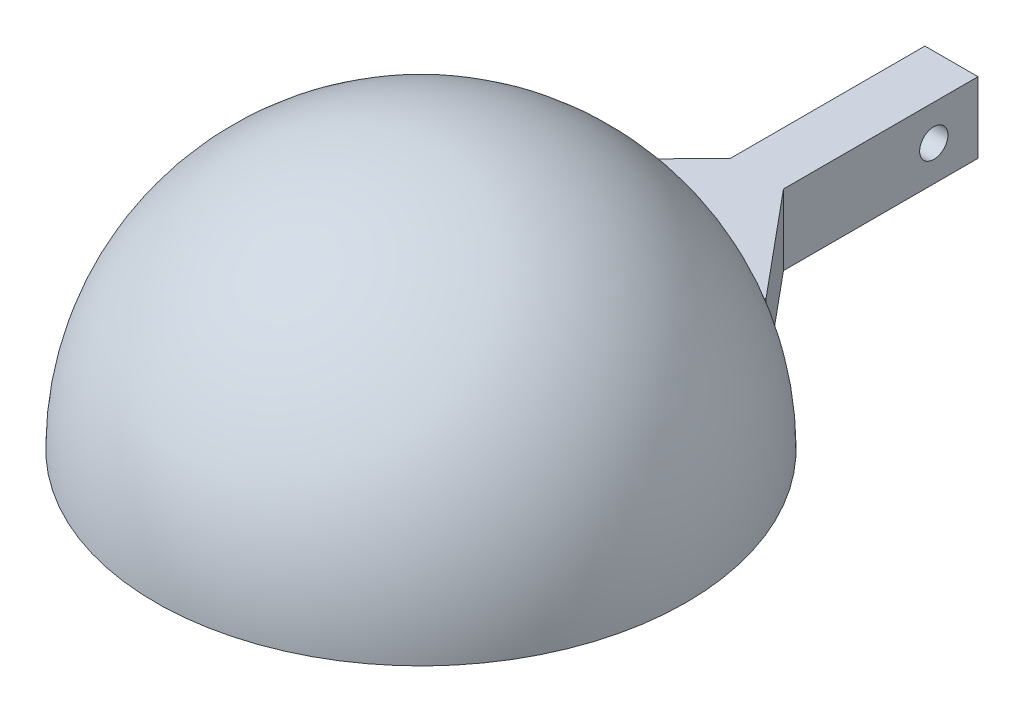
ISO-10303-21;
HEADER;
FILE_DESCRIPTION(('STEP AP214'),'2;1');
FILE_NAME('part.step','',(''),(''),'','','');
FILE_SCHEMA(('AUTOMOTIVE_DESIGN { 1 0 10303 214 1 1 1 1 }'));
ENDSEC;
DATA;
#1=APPLICATION_CONTEXT('core data for automotive mechanical design processes');
#2=APPLICATION_PROTOCOL_DEFINITION('international standard','automotive_design',2000,#1);
#3=PRODUCT_CONTEXT('',#1,'mechanical');
#4=PRODUCT('Part','Part','',(#3));
#5=PRODUCT_RELATED_PRODUCT_CATEGORY('part','',(#4));
#6=PRODUCT_DEFINITION_FORMATION('','',#4);
#7=PRODUCT_DEFINITION_CONTEXT('part definition',#1,'design');
#8=PRODUCT_DEFINITION('design','',#6,#7);
#9=PRODUCT_DEFINITION_SHAPE('','',#8);
#10=(LENGTH_UNIT() NAMED_UNIT(*) SI_UNIT(.MILLI.,.METRE.));
#11=(NAMED_UNIT(*) PLANE_ANGLE_UNIT() SI_UNIT($,.RADIAN.));
#12=(NAMED_UNIT(*) SI_UNIT($,.STERADIAN.) SOLID_ANGLE_UNIT());
#13=UNCERTAINTY_MEASURE_WITH_UNIT(LENGTH_MEASURE(1.E-05),#10,'distance_accuracy_value','');
#14=(GEOMETRIC_REPRESENTATION_CONTEXT(3) GLOBAL_UNCERTAINTY_ASSIGNED_CONTEXT((#13)) GLOBAL_UNIT_ASSIGNED_CONTEXT((#10,
#11,#12)) REPRESENTATION_CONTEXT('',''));
#15=CARTESIAN_POINT('',(0.,0.,0.));
#16=DIRECTION('',(0.,0.,1.));
#17=DIRECTION('',(1.,0.,0.));
#18=AXIS2_PLACEMENT_3D('',#15,#16,#17);
#19=CARTESIAN_POINT('',(-20.5301903420692,8.,-20.0496930716239));
#20=DIRECTION('',(0.715429322256353,0.,0.698685111374084));
#21=DIRECTION('',(0.698685111374084,0.,-0.715429322256353));
#22=AXIS2_PLACEMENT_3D('',#19,#20,#21);
#23=PLANE('',#22);
#24=DIRECTION('',(-0.698685111374084,0.,0.715429322256353));
#25=VECTOR('',#24,1.);
#26=CARTESIAN_POINT('',(-20.5301903420692,0.,-20.0496930716239));
#27=LINE('',#26,#25);
#28=CARTESIAN_POINT('',(-3.,0.,-38.));
#29=VERTEX_POINT('',#28);
#30=CARTESIAN_POINT('',(-14.4183490398174,0.,-26.308006594305));
#31=VERTEX_POINT('',#30);
#32=EDGE_CURVE('E141',#29,#31,#27,.T.);
#33=ORIENTED_EDGE('',*,*,#32,.T.);
#34=DIRECTION('',(0.,-1.,0.));
#35=VECTOR('',#34,1.);
#36=CARTESIAN_POINT('',(-14.4183490398174,8.,-26.308006594305));
#37=LINE('',#36,#35);
#38=CARTESIAN_POINT('',(-14.4183490398174,8.,-26.308006594305));
#39=VERTEX_POINT('',#38);
#40=EDGE_CURVE('E12',#39,#31,#37,.T.);
#41=ORIENTED_EDGE('',*,*,#40,.F.);
#42=DIRECTION('',(-0.698685111374084,0.,0.715429322256353));
#43=VECTOR('',#42,1.);
#44=CARTESIAN_POINT('',(-20.5301903420692,8.,-20.0496930716239));
#45=LINE('',#44,#43);
#46=CARTESIAN_POINT('',(-3.,8.,-38.));
#47=VERTEX_POINT('',#46);
#48=EDGE_CURVE('E158',#47,#39,#45,.T.);
#49=ORIENTED_EDGE('',*,*,#48,.F.);
#50=DIRECTION('',(0.,-1.,0.));
#51=VECTOR('',#50,1.);
#52=CARTESIAN_POINT('',(-3.,8.,-38.));
#53=LINE('',#52,#51);
#54=EDGE_CURVE('E140',#47,#29,#53,.T.);
#55=ORIENTED_EDGE('',*,*,#54,.T.);
#56=EDGE_LOOP('',(#33,#41,#49,#55));
#57=FACE_BOUND('',#56,.T.);
#58=ADVANCED_FACE('F43',(#57),#23,.F.);
#59=CARTESIAN_POINT('',(0.,8.,0.));
#60=DIRECTION('',(0.8769335531435,0.,-0.480611634660581));
#61=DIRECTION('',(-0.480611634660581,0.,-0.8769335531435));
#62=AXIS2_PLACEMENT_3D('',#59,#60,#61);
#63=PLANE('',#62);
#64=DIRECTION('',(0.480611634660581,0.,0.8769335531435));
#65=VECTOR('',#64,1.);
#66=CARTESIAN_POINT('',(0.,0.,0.));
#67=LINE('',#66,#65);
#68=CARTESIAN_POINT('',(-13.4571257704963,0.,-24.554139488018));
#69=VERTEX_POINT('',#68);
#70=EDGE_CURVE('E94',#31,#69,#67,.T.);
#71=ORIENTED_EDGE('',*,*,#70,.T.);
#72=DIRECTION('',(0.,-1.,0.));
#73=VECTOR('',#72,1.);
#74=CARTESIAN_POINT('',(-13.4571257704963,8.,-24.554139488018));
#75=LINE('',#74,#73);
#76=CARTESIAN_POINT('',(-13.4571257704963,8.,-24.554139488018));
#77=VERTEX_POINT('',#76);
#78=EDGE_CURVE('E52',#77,#69,#75,.T.);
#79=ORIENTED_EDGE('',*,*,#78,.F.);
#80=DIRECTION('',(0.480611634660581,0.,0.8769335531435));
#81=VECTOR('',#80,1.);
#82=CARTESIAN_POINT('',(0.,8.,0.));
#83=LINE('',#82,#81);
#84=EDGE_CURVE('E60',#39,#77,#83,.T.);
#85=ORIENTED_EDGE('',*,*,#84,.F.);
#86=ORIENTED_EDGE('',*,*,#40,.T.);
#87=EDGE_LOOP('',(#71,#79,#85,#86));
#88=FACE_BOUND('',#87,.T.);
#89=ADVANCED_FACE('F209',(#88),#63,.F.);
#90=CARTESIAN_POINT('',(0.,8.,0.));
#91=DIRECTION('',(0.,-1.,0.));
#92=DIRECTION('',(0.,0.,-1.));
#93=AXIS2_PLACEMENT_3D('',#90,#91,#92);
#94=CYLINDRICAL_SURFACE('',#93,28.);
#95=CARTESIAN_POINT('',(0.,0.,0.));
#96=DIRECTION('',(0.,-1.,0.));
#97=DIRECTION('',(0.,0.,-1.));
#98=AXIS2_PLACEMENT_3D('',#95,#96,#97);
#99=CIRCLE('',#98,28.);
#100=CARTESIAN_POINT('',(12.1903463480089,0.,-25.2070517100986));
#101=VERTEX_POINT('',#100);
#102=EDGE_CURVE('E119',#101,#69,#99,.F.);
#103=ORIENTED_EDGE('',*,*,#102,.F.);
#104=DIRECTION('',(0.,-1.,0.));
#105=VECTOR('',#104,1.);
#106=CARTESIAN_POINT('',(12.1903463480089,8.,-25.2070517100986));
#107=LINE('',#106,#105);
#108=CARTESIAN_POINT('',(12.1903463480089,8.,-25.2070517100986));
#109=VERTEX_POINT('',#108);
#110=EDGE_CURVE('E115',#109,#101,#107,.T.);
#111=ORIENTED_EDGE('',*,*,#110,.F.);
#112=CARTESIAN_POINT('',(0.,8.,0.));
#113=DIRECTION('',(0.,-1.,0.));
#114=DIRECTION('',(0.,0.,-1.));
#115=AXIS2_PLACEMENT_3D('',#112,#113,#114);
#116=CIRCLE('',#115,28.);
#117=EDGE_CURVE('E118',#109,#77,#116,.F.);
#118=ORIENTED_EDGE('',*,*,#117,.T.);
#119=ORIENTED_EDGE('',*,*,#78,.T.);
#120=EDGE_LOOP('',(#103,#111,#118,#119));
#121=FACE_BOUND('',#120,.T.);
#122=ADVANCED_FACE('F117',(#121),#94,.F.);
#123=CARTESIAN_POINT('',(0.,8.,0.));
#124=DIRECTION('',(0.900251846789237,0.,0.435369512428888));
#125=DIRECTION('',(0.435369512428888,0.,-0.900251846789237));
#126=AXIS2_PLACEMENT_3D('',#123,#124,#125);
#127=PLANE('',#126);
#128=DIRECTION('',(-0.435369512428888,0.,0.900251846789237));
#129=VECTOR('',#128,1.);
#130=CARTESIAN_POINT('',(0.,0.,0.));
#131=LINE('',#130,#129);
#132=CARTESIAN_POINT('',(12.7227775702859,0.,-26.308006594305));
#133=VERTEX_POINT('',#132);
#134=EDGE_CURVE('E155',#133,#101,#131,.T.);
#135=ORIENTED_EDGE('',*,*,#134,.F.);
#136=DIRECTION('',(0.,-1.,0.));
#137=VECTOR('',#136,1.);
#138=CARTESIAN_POINT('',(12.7227775702859,8.,-26.308006594305));
#139=LINE('',#138,#137);
#140=CARTESIAN_POINT('',(12.7227775702859,8.,-26.308006594305));
#141=VERTEX_POINT('',#140);
#142=EDGE_CURVE('E124',#141,#133,#139,.T.);
#143=ORIENTED_EDGE('',*,*,#142,.F.);
#144=DIRECTION('',(-0.435369512428888,0.,0.900251846789237));
#145=VECTOR('',#144,1.);
#146=CARTESIAN_POINT('',(0.,8.,0.));
#147=LINE('',#146,#145);
#148=EDGE_CURVE('E129',#141,#109,#147,.T.);
#149=ORIENTED_EDGE('',*,*,#148,.T.);
#150=ORIENTED_EDGE('',*,*,#110,.T.);
#151=EDGE_LOOP('',(#135,#143,#149,#150));
#152=FACE_BOUND('',#151,.T.);
#153=ADVANCED_FACE('F132',(#152),#127,.T.);
#154=CARTESIAN_POINT('',(20.4549248823464,8.,-17.0098184242124));
#155=DIRECTION('',(0.768885498760629,0.,-0.639386494849257));
#156=DIRECTION('',(-0.639386494849257,0.,-0.768885498760629));
#157=AXIS2_PLACEMENT_3D('',#154,#155,#156);
#158=PLANE('',#157);
#159=DIRECTION('',(0.639386494849257,0.,0.768885498760629));
#160=VECTOR('',#159,1.);
#161=CARTESIAN_POINT('',(20.4549248823464,0.,-17.0098184242124));
#162=LINE('',#161,#160);
#163=CARTESIAN_POINT('',(3.,0.,-38.));
#164=VERTEX_POINT('',#163);
#165=EDGE_CURVE('E152',#164,#133,#162,.T.);
#166=ORIENTED_EDGE('',*,*,#165,.F.);
#167=DIRECTION('',(0.,-1.,0.));
#168=VECTOR('',#167,1.);
#169=CARTESIAN_POINT('',(3.,8.,-38.));
#170=LINE('',#169,#168);
#171=CARTESIAN_POINT('',(3.,8.,-38.));
#172=VERTEX_POINT('',#171);
#173=EDGE_CURVE('E162',#172,#164,#170,.T.);
#174=ORIENTED_EDGE('',*,*,#173,.F.);
#175=DIRECTION('',(0.639386494849257,0.,0.768885498760629));
#176=VECTOR('',#175,1.);
#177=CARTESIAN_POINT('',(20.4549248823464,8.,-17.0098184242124));
#178=LINE('',#177,#176);
#179=EDGE_CURVE('E133',#172,#141,#178,.T.);
#180=ORIENTED_EDGE('',*,*,#179,.T.);
#181=ORIENTED_EDGE('',*,*,#142,.T.);
#182=EDGE_LOOP('',(#166,#174,#180,#181));
#183=FACE_BOUND('',#182,.T.);
#184=ADVANCED_FACE('F186',(#183),#158,.T.);
#185=CARTESIAN_POINT('',(3.,8.,0.));
#186=DIRECTION('',(1.,0.,0.));
#187=DIRECTION('',(0.,0.,-1.));
#188=AXIS2_PLACEMENT_3D('',#185,#186,#187);
#189=PLANE('',#188);
#190=CARTESIAN_POINT('',(3.,4.,-55.));
#191=DIRECTION('',(1.,0.,0.));
#192=DIRECTION('',(0.,0.,-1.));
#193=AXIS2_PLACEMENT_3D('',#190,#191,#192);
#194=CIRCLE('',#193,1.6);
#195=CARTESIAN_POINT('',(3.,4.,-56.6));
#196=VERTEX_POINT('',#195);
#197=EDGE_CURVE('E191',#196,#196,#194,.T.);
#198=ORIENTED_EDGE('',*,*,#197,.F.);
#199=EDGE_LOOP('',(#198));
#200=FACE_BOUND('',#199,.T.);
#201=DIRECTION('',(0.,0.,1.));
#202=VECTOR('',#201,1.);
#203=CARTESIAN_POINT('',(3.,0.,0.));
#204=LINE('',#203,#202);
#205=CARTESIAN_POINT('',(3.,0.,-60.));
#206=VERTEX_POINT('',#205);
#207=EDGE_CURVE('E149',#206,#164,#204,.T.);
#208=ORIENTED_EDGE('',*,*,#207,.F.);
#209=DIRECTION('',(0.,-1.,0.));
#210=VECTOR('',#209,1.);
#211=CARTESIAN_POINT('',(3.,8.,-60.));
#212=LINE('',#211,#210);
#213=CARTESIAN_POINT('',(3.,8.,-60.));
#214=VERTEX_POINT('',#213);
#215=EDGE_CURVE('E164',#214,#206,#212,.T.);
#216=ORIENTED_EDGE('',*,*,#215,.F.);
#217=DIRECTION('',(0.,0.,1.));
#218=VECTOR('',#217,1.);
#219=CARTESIAN_POINT('',(3.,8.,0.));
#220=LINE('',#219,#218);
#221=EDGE_CURVE('E135',#214,#172,#220,.T.);
#222=ORIENTED_EDGE('',*,*,#221,.T.);
#223=ORIENTED_EDGE('',*,*,#173,.T.);
#224=EDGE_LOOP('',(#208,#216,#222,#223));
#225=FACE_BOUND('',#224,.T.);
#226=ADVANCED_FACE('F183',(#200,#225),#189,.T.);
#227=CARTESIAN_POINT('',(0.,8.,-60.));
#228=DIRECTION('',(0.,0.,-1.));
#229=DIRECTION('',(-1.,0.,0.));
#230=AXIS2_PLACEMENT_3D('',#227,#228,#229);
#231=PLANE('',#230);
#232=DIRECTION('',(1.,0.,0.));
#233=VECTOR('',#232,1.);
#234=CARTESIAN_POINT('',(0.,0.,-60.));
#235=LINE('',#234,#233);
#236=CARTESIAN_POINT('',(-3.,0.,-60.));
#237=VERTEX_POINT('',#236);
#238=EDGE_CURVE('E146',#237,#206,#235,.T.);
#239=ORIENTED_EDGE('',*,*,#238,.F.);
#240=DIRECTION('',(0.,-1.,0.));
#241=VECTOR('',#240,1.);
#242=CARTESIAN_POINT('',(-3.,8.,-60.));
#243=LINE('',#242,#241);
#244=CARTESIAN_POINT('',(-3.,8.,-60.));
#245=VERTEX_POINT('',#244);
#246=EDGE_CURVE('E166',#245,#237,#243,.T.);
#247=ORIENTED_EDGE('',*,*,#246,.F.);
#248=DIRECTION('',(1.,0.,0.));
#249=VECTOR('',#248,1.);
#250=CARTESIAN_POINT('',(0.,8.,-60.));
#251=LINE('',#250,#249);
#252=EDGE_CURVE('E179',#245,#214,#251,.T.);
#253=ORIENTED_EDGE('',*,*,#252,.T.);
#254=ORIENTED_EDGE('',*,*,#215,.T.);
#255=EDGE_LOOP('',(#239,#247,#253,#254));
#256=FACE_BOUND('',#255,.T.);
#257=ADVANCED_FACE('F176',(#256),#231,.T.);
#258=CARTESIAN_POINT('',(-3.00000000000001,8.,0.));
#259=DIRECTION('',(1.,0.,0.));
#260=DIRECTION('',(0.,0.,-1.));
#261=AXIS2_PLACEMENT_3D('',#258,#259,#260);
#262=PLANE('',#261);
#263=CARTESIAN_POINT('',(-3.,4.,-55.));
#264=DIRECTION('',(1.,0.,0.));
#265=DIRECTION('',(0.,0.,-1.));
#266=AXIS2_PLACEMENT_3D('',#263,#264,#265);
#267=CIRCLE('',#266,1.6);
#268=CARTESIAN_POINT('',(-3.,4.,-56.6));
#269=VERTEX_POINT('',#268);
#270=EDGE_CURVE('E46',#269,#269,#267,.T.);
#271=ORIENTED_EDGE('',*,*,#270,.T.);
#272=EDGE_LOOP('',(#271));
#273=FACE_BOUND('',#272,.T.);
#274=DIRECTION('',(0.,0.,1.));
#275=VECTOR('',#274,1.);
#276=CARTESIAN_POINT('',(-3.00000000000001,0.,0.));
#277=LINE('',#276,#275);
#278=EDGE_CURVE('E144',#237,#29,#277,.T.);
#279=ORIENTED_EDGE('',*,*,#278,.T.);
#280=ORIENTED_EDGE('',*,*,#54,.F.);
#281=DIRECTION('',(0.,0.,1.));
#282=VECTOR('',#281,1.);
#283=CARTESIAN_POINT('',(-3.00000000000001,8.,0.));
#284=LINE('',#283,#282);
#285=EDGE_CURVE('E101',#245,#47,#284,.T.);
#286=ORIENTED_EDGE('',*,*,#285,.F.);
#287=ORIENTED_EDGE('',*,*,#246,.T.);
#288=EDGE_LOOP('',(#279,#280,#286,#287));
#289=FACE_BOUND('',#288,.T.);
#290=ADVANCED_FACE('F198',(#273,#289),#262,.F.);
#291=CARTESIAN_POINT('',(0.,8.,0.));
#292=DIRECTION('',(0.,-1.,0.));
#293=DIRECTION('',(0.,0.,-1.));
#294=AXIS2_PLACEMENT_3D('',#291,#292,#293);
#295=PLANE('',#294);
#296=ORIENTED_EDGE('',*,*,#48,.T.);
#297=ORIENTED_EDGE('',*,*,#84,.T.);
#298=ORIENTED_EDGE('',*,*,#117,.F.);
#299=ORIENTED_EDGE('',*,*,#148,.F.);
#300=ORIENTED_EDGE('',*,*,#179,.F.);
#301=ORIENTED_EDGE('',*,*,#221,.F.);
#302=ORIENTED_EDGE('',*,*,#252,.F.);
#303=ORIENTED_EDGE('',*,*,#285,.T.);
#304=EDGE_LOOP('',(#296,#297,#298,#299,#300,#301,#302,#303));
#305=FACE_BOUND('',#304,.T.);
#306=ADVANCED_FACE('F127',(#305),#295,.F.);
#307=CARTESIAN_POINT('',(0.,0.,0.));
#308=DIRECTION('',(0.,-1.,0.));
#309=DIRECTION('',(0.,0.,-1.));
#310=AXIS2_PLACEMENT_3D('',#307,#308,#309);
#311=PLANE('',#310);
#312=ORIENTED_EDGE('',*,*,#32,.F.);
#313=ORIENTED_EDGE('',*,*,#278,.F.);
#314=ORIENTED_EDGE('',*,*,#238,.T.);
#315=ORIENTED_EDGE('',*,*,#207,.T.);
#316=ORIENTED_EDGE('',*,*,#165,.T.);
#317=ORIENTED_EDGE('',*,*,#134,.T.);
#318=ORIENTED_EDGE('',*,*,#102,.T.);
#319=ORIENTED_EDGE('',*,*,#70,.F.);
#320=EDGE_LOOP('',(#312,#313,#314,#315,#316,#317,#318,#319));
#321=FACE_BOUND('',#320,.T.);
#322=ADVANCED_FACE('F173',(#321),#311,.T.);
#323=CARTESIAN_POINT('',(-30.,4.,-55.));
#324=DIRECTION('',(1.,0.,0.));
#325=DIRECTION('',(0.,0.,-1.));
#326=AXIS2_PLACEMENT_3D('',#323,#324,#325);
#327=CYLINDRICAL_SURFACE('',#326,1.6);
#328=ORIENTED_EDGE('',*,*,#197,.T.);
#329=EDGE_LOOP('',(#328));
#330=FACE_BOUND('',#329,.T.);
#331=ORIENTED_EDGE('',*,*,#270,.F.);
#332=EDGE_LOOP('',(#331));
#333=FACE_BOUND('',#332,.T.);
#334=ADVANCED_FACE('F200',(#330,#333),#327,.F.);
#335=CLOSED_SHELL('',(#58,#89,#122,#153,#184,#226,#257,#290,#306,#322,#334));
#336=MANIFOLD_SOLID_BREP('B2',#335);
#337=CARTESIAN_POINT('',(0.,0.,0.));
#338=DIRECTION('',(0.,-1.,0.));
#339=DIRECTION('',(1.,0.,0.));
#340=AXIS2_PLACEMENT_3D('',#337,#338,#339);
#341=SPHERICAL_SURFACE('',#340,30.);
#342=CARTESIAN_POINT('',(0.,0.,0.));
#343=DIRECTION('',(0.,-1.,0.));
#344=DIRECTION('',(0.,0.,-1.));
#345=AXIS2_PLACEMENT_3D('',#342,#343,#344);
#346=CIRCLE('',#345,30.);
#347=CARTESIAN_POINT('',(0.,0.,-30.));
#348=VERTEX_POINT('',#347);
#349=EDGE_CURVE('E42',#348,#348,#346,.T.);
#350=ORIENTED_EDGE('',*,*,#349,.F.);
#351=EDGE_LOOP('',(#350));
#352=FACE_BOUND('',#351,.T.);
#353=ADVANCED_FACE('F313',(#352),#341,.T.);
#354=CARTESIAN_POINT('',(28.,0.,0.));
#355=DIRECTION('',(0.,-1.,0.));
#356=DIRECTION('',(0.,0.,-1.));
#357=AXIS2_PLACEMENT_3D('',#354,#355,#356);
#358=PLANE('',#357);
#359=ORIENTED_EDGE('',*,*,#349,.T.);
#360=EDGE_LOOP('',(#359));
#361=FACE_BOUND('',#360,.T.);
#362=CARTESIAN_POINT('',(0.,0.,0.));
#363=DIRECTION('',(0.,-1.,0.));
#364=DIRECTION('',(0.,0.,-1.));
#365=AXIS2_PLACEMENT_3D('',#362,#363,#364);
#366=CIRCLE('',#365,28.);
#367=CARTESIAN_POINT('',(0.,0.,-28.));
#368=VERTEX_POINT('',#367);
#369=EDGE_CURVE('E319',#368,#368,#366,.T.);
#370=ORIENTED_EDGE('',*,*,#369,.F.);
#371=EDGE_LOOP('',(#370));
#372=FACE_BOUND('',#371,.T.);
#373=ADVANCED_FACE('F327',(#361,#372),#358,.T.);
#374=CARTESIAN_POINT('',(0.,0.,0.));
#375=DIRECTION('',(0.,-1.,0.));
#376=DIRECTION('',(1.,0.,0.));
#377=AXIS2_PLACEMENT_3D('',#374,#375,#376);
#378=SPHERICAL_SURFACE('',#377,28.);
#379=ORIENTED_EDGE('',*,*,#369,.T.);
#380=EDGE_LOOP('',(#379));
#381=FACE_BOUND('',#380,.T.);
#382=ADVANCED_FACE('F325',(#381),#378,.F.);
#383=CLOSED_SHELL('',(#353,#373,#382));
#384=MANIFOLD_SOLID_BREP('B6',#383);
#385=ADVANCED_BREP_SHAPE_REPRESENTATION('',(#18,#336,#384),#14);
#386=SHAPE_DEFINITION_REPRESENTATION(#9,#385);
ENDSEC;
END-ISO-10303-21;
